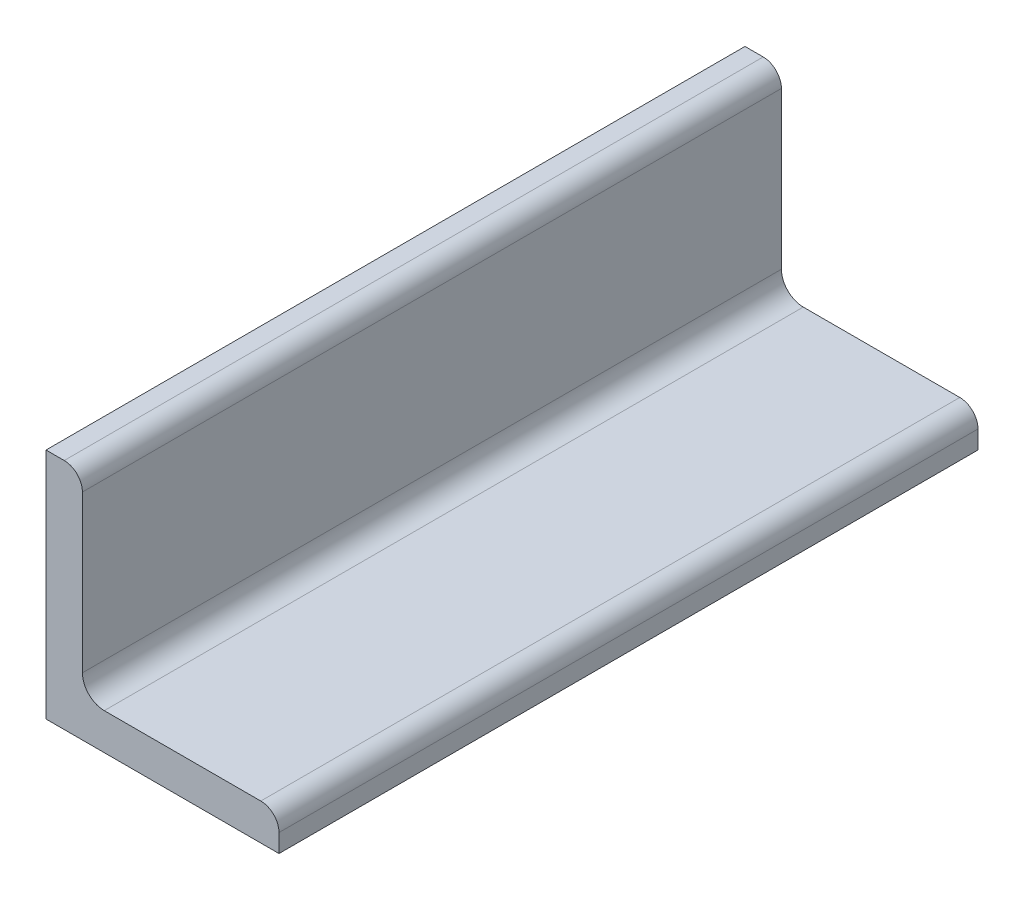
ISO-10303-21;
HEADER;
FILE_DESCRIPTION(('STEP AP214'),'2;1');
FILE_NAME('part.step','',(''),(''),'','','');
FILE_SCHEMA(('AUTOMOTIVE_DESIGN { 1 0 10303 214 1 1 1 1 }'));
ENDSEC;
DATA;
#1=APPLICATION_CONTEXT('core data for automotive mechanical design processes');
#2=APPLICATION_PROTOCOL_DEFINITION('international standard','automotive_design',2000,#1);
#3=PRODUCT_CONTEXT('',#1,'mechanical');
#4=PRODUCT('Part','Part','',(#3));
#5=PRODUCT_RELATED_PRODUCT_CATEGORY('part','',(#4));
#6=PRODUCT_DEFINITION_FORMATION('','',#4);
#7=PRODUCT_DEFINITION_CONTEXT('part definition',#1,'design');
#8=PRODUCT_DEFINITION('design','',#6,#7);
#9=PRODUCT_DEFINITION_SHAPE('','',#8);
#10=(LENGTH_UNIT() NAMED_UNIT(*) SI_UNIT(.MILLI.,.METRE.));
#11=(NAMED_UNIT(*) PLANE_ANGLE_UNIT() SI_UNIT($,.RADIAN.));
#12=(NAMED_UNIT(*) SI_UNIT($,.STERADIAN.) SOLID_ANGLE_UNIT());
#13=UNCERTAINTY_MEASURE_WITH_UNIT(LENGTH_MEASURE(1.E-05),#10,'distance_accuracy_value','');
#14=(GEOMETRIC_REPRESENTATION_CONTEXT(3) GLOBAL_UNCERTAINTY_ASSIGNED_CONTEXT((#13)) GLOBAL_UNIT_ASSIGNED_CONTEXT((#10,
#11,#12)) REPRESENTATION_CONTEXT('',''));
#15=CARTESIAN_POINT('',(0.,0.,0.));
#16=DIRECTION('',(0.,0.,1.));
#17=DIRECTION('',(1.,0.,0.));
#18=AXIS2_PLACEMENT_3D('',#15,#16,#17);
#19=CARTESIAN_POINT('',(0.865045893659089,102.172018782971,304.8));
#20=DIRECTION('',(1.,0.,0.));
#21=DIRECTION('',(0.,0.,-1.));
#22=AXIS2_PLACEMENT_3D('',#19,#20,#21);
#23=PLANE('',#22);
#24=DIRECTION('',(0.,-1.,0.));
#25=VECTOR('',#24,1.);
#26=CARTESIAN_POINT('',(0.865045893659089,102.172018782971,0.));
#27=LINE('',#26,#25);
#28=CARTESIAN_POINT('',(0.865045893659089,102.172018782971,0.));
#29=VERTEX_POINT('',#28);
#30=CARTESIAN_POINT('',(0.865045893659089,0.572018782971054,0.));
#31=VERTEX_POINT('',#30);
#32=EDGE_CURVE('E135',#29,#31,#27,.T.);
#33=ORIENTED_EDGE('',*,*,#32,.T.);
#34=DIRECTION('',(0.,0.,-1.));
#35=VECTOR('',#34,1.);
#36=CARTESIAN_POINT('',(0.865045893659089,0.572018782971054,304.8));
#37=LINE('',#36,#35);
#38=CARTESIAN_POINT('',(0.865045893659089,0.572018782971054,304.8));
#39=VERTEX_POINT('',#38);
#40=EDGE_CURVE('E11',#39,#31,#37,.T.);
#41=ORIENTED_EDGE('',*,*,#40,.F.);
#42=DIRECTION('',(0.,-1.,0.));
#43=VECTOR('',#42,1.);
#44=CARTESIAN_POINT('',(0.865045893659089,102.172018782971,304.8));
#45=LINE('',#44,#43);
#46=CARTESIAN_POINT('',(0.865045893659089,102.172018782971,304.8));
#47=VERTEX_POINT('',#46);
#48=EDGE_CURVE('E151',#47,#39,#45,.T.);
#49=ORIENTED_EDGE('',*,*,#48,.F.);
#50=DIRECTION('',(0.,0.,-1.));
#51=VECTOR('',#50,1.);
#52=CARTESIAN_POINT('',(0.865045893659089,102.172018782971,304.8));
#53=LINE('',#52,#51);
#54=EDGE_CURVE('E131',#47,#29,#53,.T.);
#55=ORIENTED_EDGE('',*,*,#54,.T.);
#56=EDGE_LOOP('',(#33,#41,#49,#55));
#57=FACE_BOUND('',#56,.T.);
#58=ADVANCED_FACE('F33',(#57),#23,.F.);
#59=CARTESIAN_POINT('',(0.865045893659089,0.572018782971054,304.8));
#60=DIRECTION('',(0.,1.,0.));
#61=DIRECTION('',(0.,0.,1.));
#62=AXIS2_PLACEMENT_3D('',#59,#60,#61);
#63=PLANE('',#62);
#64=DIRECTION('',(1.,0.,0.));
#65=VECTOR('',#64,1.);
#66=CARTESIAN_POINT('',(0.865045893659089,0.572018782971054,0.));
#67=LINE('',#66,#65);
#68=CARTESIAN_POINT('',(102.465045893659,0.572018782971054,0.));
#69=VERTEX_POINT('',#68);
#70=EDGE_CURVE('E138',#31,#69,#67,.T.);
#71=ORIENTED_EDGE('',*,*,#70,.T.);
#72=DIRECTION('',(0.,0.,-1.));
#73=VECTOR('',#72,1.);
#74=CARTESIAN_POINT('',(102.465045893659,0.572018782971054,304.8));
#75=LINE('',#74,#73);
#76=CARTESIAN_POINT('',(102.465045893659,0.572018782971054,304.8));
#77=VERTEX_POINT('',#76);
#78=EDGE_CURVE('E41',#77,#69,#75,.T.);
#79=ORIENTED_EDGE('',*,*,#78,.F.);
#80=DIRECTION('',(1.,0.,0.));
#81=VECTOR('',#80,1.);
#82=CARTESIAN_POINT('',(0.865045893659089,0.572018782971054,304.8));
#83=LINE('',#82,#81);
#84=EDGE_CURVE('E95',#39,#77,#83,.T.);
#85=ORIENTED_EDGE('',*,*,#84,.F.);
#86=ORIENTED_EDGE('',*,*,#40,.T.);
#87=EDGE_LOOP('',(#71,#79,#85,#86));
#88=FACE_BOUND('',#87,.T.);
#89=ADVANCED_FACE('F194',(#88),#63,.F.);
#90=CARTESIAN_POINT('',(102.465045893659,0.572018782971054,304.8));
#91=DIRECTION('',(-1.,0.,0.));
#92=DIRECTION('',(0.,0.,1.));
#93=AXIS2_PLACEMENT_3D('',#90,#91,#92);
#94=PLANE('',#93);
#95=DIRECTION('',(0.,1.,0.));
#96=VECTOR('',#95,1.);
#97=CARTESIAN_POINT('',(102.465045893659,0.572018782971054,0.));
#98=LINE('',#97,#96);
#99=CARTESIAN_POINT('',(102.465045893659,8.50951878297105,0.));
#100=VERTEX_POINT('',#99);
#101=EDGE_CURVE('E140',#69,#100,#98,.T.);
#102=ORIENTED_EDGE('',*,*,#101,.T.);
#103=DIRECTION('',(0.,0.,-1.));
#104=VECTOR('',#103,1.);
#105=CARTESIAN_POINT('',(102.465045893659,8.50951878297105,304.8));
#106=LINE('',#105,#104);
#107=CARTESIAN_POINT('',(102.465045893659,8.50951878297105,304.8));
#108=VERTEX_POINT('',#107);
#109=EDGE_CURVE('E161',#108,#100,#106,.T.);
#110=ORIENTED_EDGE('',*,*,#109,.F.);
#111=DIRECTION('',(0.,1.,0.));
#112=VECTOR('',#111,1.);
#113=CARTESIAN_POINT('',(102.465045893659,0.572018782971054,304.8));
#114=LINE('',#113,#112);
#115=EDGE_CURVE('E169',#77,#108,#114,.T.);
#116=ORIENTED_EDGE('',*,*,#115,.F.);
#117=ORIENTED_EDGE('',*,*,#78,.T.);
#118=EDGE_LOOP('',(#102,#110,#116,#117));
#119=FACE_BOUND('',#118,.T.);
#120=ADVANCED_FACE('F167',(#119),#94,.F.);
#121=CARTESIAN_POINT('',(94.5275458936591,8.50951878297105,304.8));
#122=DIRECTION('',(0.,0.,-1.));
#123=DIRECTION('',(-1.,0.,0.));
#124=AXIS2_PLACEMENT_3D('',#121,#122,#123);
#125=CYLINDRICAL_SURFACE('',#124,7.93750000000001);
#126=CARTESIAN_POINT('',(94.5275458936591,8.50951878297105,0.));
#127=DIRECTION('',(0.,0.,1.));
#128=DIRECTION('',(1.,0.,0.));
#129=AXIS2_PLACEMENT_3D('',#126,#127,#128);
#130=CIRCLE('',#129,7.93750000000001);
#131=CARTESIAN_POINT('',(94.5275458936591,16.4470187829711,0.));
#132=VERTEX_POINT('',#131);
#133=EDGE_CURVE('E142',#100,#132,#130,.T.);
#134=ORIENTED_EDGE('',*,*,#133,.T.);
#135=DIRECTION('',(0.,0.,-1.));
#136=VECTOR('',#135,1.);
#137=CARTESIAN_POINT('',(94.5275458936591,16.4470187829711,304.8));
#138=LINE('',#137,#136);
#139=CARTESIAN_POINT('',(94.5275458936591,16.4470187829711,304.8));
#140=VERTEX_POINT('',#139);
#141=EDGE_CURVE('E158',#140,#132,#138,.T.);
#142=ORIENTED_EDGE('',*,*,#141,.F.);
#143=CARTESIAN_POINT('',(94.5275458936591,8.50951878297105,304.8));
#144=DIRECTION('',(0.,0.,1.));
#145=DIRECTION('',(1.,0.,0.));
#146=AXIS2_PLACEMENT_3D('',#143,#144,#145);
#147=CIRCLE('',#146,7.93750000000001);
#148=EDGE_CURVE('E185',#108,#140,#147,.T.);
#149=ORIENTED_EDGE('',*,*,#148,.F.);
#150=ORIENTED_EDGE('',*,*,#109,.T.);
#151=EDGE_LOOP('',(#134,#142,#149,#150));
#152=FACE_BOUND('',#151,.T.);
#153=ADVANCED_FACE('F178',(#152),#125,.T.);
#154=CARTESIAN_POINT('',(94.5275458936591,16.4470187829711,304.8));
#155=DIRECTION('',(0.,-1.,0.));
#156=DIRECTION('',(0.,0.,-1.));
#157=AXIS2_PLACEMENT_3D('',#154,#155,#156);
#158=PLANE('',#157);
#159=DIRECTION('',(-1.,0.,0.));
#160=VECTOR('',#159,1.);
#161=CARTESIAN_POINT('',(94.5275458936591,16.4470187829711,0.));
#162=LINE('',#161,#160);
#163=CARTESIAN_POINT('',(26.2650458936591,16.4470187829711,0.));
#164=VERTEX_POINT('',#163);
#165=EDGE_CURVE('E144',#132,#164,#162,.T.);
#166=ORIENTED_EDGE('',*,*,#165,.T.);
#167=DIRECTION('',(0.,0.,-1.));
#168=VECTOR('',#167,1.);
#169=CARTESIAN_POINT('',(26.2650458936591,16.4470187829711,304.8));
#170=LINE('',#169,#168);
#171=CARTESIAN_POINT('',(26.2650458936591,16.4470187829711,304.8));
#172=VERTEX_POINT('',#171);
#173=EDGE_CURVE('E155',#172,#164,#170,.T.);
#174=ORIENTED_EDGE('',*,*,#173,.F.);
#175=DIRECTION('',(-1.,0.,0.));
#176=VECTOR('',#175,1.);
#177=CARTESIAN_POINT('',(94.5275458936591,16.4470187829711,304.8));
#178=LINE('',#177,#176);
#179=EDGE_CURVE('E184',#140,#172,#178,.T.);
#180=ORIENTED_EDGE('',*,*,#179,.F.);
#181=ORIENTED_EDGE('',*,*,#141,.T.);
#182=EDGE_LOOP('',(#166,#174,#180,#181));
#183=FACE_BOUND('',#182,.T.);
#184=ADVANCED_FACE('F182',(#183),#158,.F.);
#185=CARTESIAN_POINT('',(26.2650458936591,25.972018782971,304.8));
#186=DIRECTION('',(0.,0.,-1.));
#187=DIRECTION('',(-1.,0.,0.));
#188=AXIS2_PLACEMENT_3D('',#185,#186,#187);
#189=CYLINDRICAL_SURFACE('',#188,9.52499999999999);
#190=CARTESIAN_POINT('',(26.2650458936591,25.972018782971,0.));
#191=DIRECTION('',(0.,0.,-1.));
#192=DIRECTION('',(1.,0.,0.));
#193=AXIS2_PLACEMENT_3D('',#190,#191,#192);
#194=CIRCLE('',#193,9.52499999999999);
#195=CARTESIAN_POINT('',(16.7400458936591,25.9720187829711,0.));
#196=VERTEX_POINT('',#195);
#197=EDGE_CURVE('E146',#164,#196,#194,.T.);
#198=ORIENTED_EDGE('',*,*,#197,.T.);
#199=DIRECTION('',(0.,0.,-1.));
#200=VECTOR('',#199,1.);
#201=CARTESIAN_POINT('',(16.7400458936591,25.9720187829711,304.8));
#202=LINE('',#201,#200);
#203=CARTESIAN_POINT('',(16.7400458936591,25.9720187829711,304.8));
#204=VERTEX_POINT('',#203);
#205=EDGE_CURVE('E126',#204,#196,#202,.T.);
#206=ORIENTED_EDGE('',*,*,#205,.F.);
#207=CARTESIAN_POINT('',(26.2650458936591,25.972018782971,304.8));
#208=DIRECTION('',(0.,0.,-1.));
#209=DIRECTION('',(1.,0.,0.));
#210=AXIS2_PLACEMENT_3D('',#207,#208,#209);
#211=CIRCLE('',#210,9.52499999999999);
#212=EDGE_CURVE('E117',#172,#204,#211,.T.);
#213=ORIENTED_EDGE('',*,*,#212,.F.);
#214=ORIENTED_EDGE('',*,*,#173,.T.);
#215=EDGE_LOOP('',(#198,#206,#213,#214));
#216=FACE_BOUND('',#215,.T.);
#217=ADVANCED_FACE('F206',(#216),#189,.F.);
#218=CARTESIAN_POINT('',(16.7400458936591,25.9720187829711,304.8));
#219=DIRECTION('',(-1.,0.,0.));
#220=DIRECTION('',(0.,0.,1.));
#221=AXIS2_PLACEMENT_3D('',#218,#219,#220);
#222=PLANE('',#221);
#223=DIRECTION('',(0.,1.,0.));
#224=VECTOR('',#223,1.);
#225=CARTESIAN_POINT('',(16.7400458936591,25.9720187829711,0.));
#226=LINE('',#225,#224);
#227=CARTESIAN_POINT('',(16.7400458936591,94.2345187829711,0.));
#228=VERTEX_POINT('',#227);
#229=EDGE_CURVE('E125',#196,#228,#226,.T.);
#230=ORIENTED_EDGE('',*,*,#229,.T.);
#231=DIRECTION('',(0.,0.,-1.));
#232=VECTOR('',#231,1.);
#233=CARTESIAN_POINT('',(16.7400458936591,94.2345187829711,304.8));
#234=LINE('',#233,#232);
#235=CARTESIAN_POINT('',(16.7400458936591,94.2345187829711,304.8));
#236=VERTEX_POINT('',#235);
#237=EDGE_CURVE('E122',#236,#228,#234,.T.);
#238=ORIENTED_EDGE('',*,*,#237,.F.);
#239=DIRECTION('',(0.,1.,0.));
#240=VECTOR('',#239,1.);
#241=CARTESIAN_POINT('',(16.7400458936591,25.9720187829711,304.8));
#242=LINE('',#241,#240);
#243=EDGE_CURVE('E111',#204,#236,#242,.T.);
#244=ORIENTED_EDGE('',*,*,#243,.F.);
#245=ORIENTED_EDGE('',*,*,#205,.T.);
#246=EDGE_LOOP('',(#230,#238,#244,#245));
#247=FACE_BOUND('',#246,.T.);
#248=ADVANCED_FACE('F123',(#247),#222,.F.);
#249=CARTESIAN_POINT('',(8.8025458936591,94.234518782971,304.8));
#250=DIRECTION('',(0.,0.,-1.));
#251=DIRECTION('',(-1.,0.,0.));
#252=AXIS2_PLACEMENT_3D('',#249,#250,#251);
#253=CYLINDRICAL_SURFACE('',#252,7.9375);
#254=CARTESIAN_POINT('',(8.8025458936591,94.234518782971,0.));
#255=DIRECTION('',(0.,0.,1.));
#256=DIRECTION('',(1.,0.,0.));
#257=AXIS2_PLACEMENT_3D('',#254,#255,#256);
#258=CIRCLE('',#257,7.9375);
#259=CARTESIAN_POINT('',(8.80254589365909,102.172018782971,0.));
#260=VERTEX_POINT('',#259);
#261=EDGE_CURVE('E81',#228,#260,#258,.T.);
#262=ORIENTED_EDGE('',*,*,#261,.T.);
#263=DIRECTION('',(0.,0.,-1.));
#264=VECTOR('',#263,1.);
#265=CARTESIAN_POINT('',(8.80254589365909,102.172018782971,304.8));
#266=LINE('',#265,#264);
#267=CARTESIAN_POINT('',(8.80254589365909,102.172018782971,304.8));
#268=VERTEX_POINT('',#267);
#269=EDGE_CURVE('E127',#268,#260,#266,.T.);
#270=ORIENTED_EDGE('',*,*,#269,.F.);
#271=CARTESIAN_POINT('',(8.8025458936591,94.234518782971,304.8));
#272=DIRECTION('',(0.,0.,1.));
#273=DIRECTION('',(1.,0.,0.));
#274=AXIS2_PLACEMENT_3D('',#271,#272,#273);
#275=CIRCLE('',#274,7.9375);
#276=EDGE_CURVE('E115',#236,#268,#275,.T.);
#277=ORIENTED_EDGE('',*,*,#276,.F.);
#278=ORIENTED_EDGE('',*,*,#237,.T.);
#279=EDGE_LOOP('',(#262,#270,#277,#278));
#280=FACE_BOUND('',#279,.T.);
#281=ADVANCED_FACE('F129',(#280),#253,.T.);
#282=CARTESIAN_POINT('',(8.80254589365909,102.172018782971,304.8));
#283=DIRECTION('',(0.,-1.,0.));
#284=DIRECTION('',(0.,0.,-1.));
#285=AXIS2_PLACEMENT_3D('',#282,#283,#284);
#286=PLANE('',#285);
#287=DIRECTION('',(-1.,0.,0.));
#288=VECTOR('',#287,1.);
#289=CARTESIAN_POINT('',(8.80254589365909,102.172018782971,0.));
#290=LINE('',#289,#288);
#291=EDGE_CURVE('E87',#260,#29,#290,.T.);
#292=ORIENTED_EDGE('',*,*,#291,.T.);
#293=ORIENTED_EDGE('',*,*,#54,.F.);
#294=DIRECTION('',(-1.,0.,0.));
#295=VECTOR('',#294,1.);
#296=CARTESIAN_POINT('',(8.80254589365909,102.172018782971,304.8));
#297=LINE('',#296,#295);
#298=EDGE_CURVE('E49',#268,#47,#297,.T.);
#299=ORIENTED_EDGE('',*,*,#298,.F.);
#300=ORIENTED_EDGE('',*,*,#269,.T.);
#301=EDGE_LOOP('',(#292,#293,#299,#300));
#302=FACE_BOUND('',#301,.T.);
#303=ADVANCED_FACE('F214',(#302),#286,.F.);
#304=CARTESIAN_POINT('',(94.5275458936591,8.50951878297105,304.8));
#305=DIRECTION('',(0.,0.,1.));
#306=DIRECTION('',(1.,0.,0.));
#307=AXIS2_PLACEMENT_3D('',#304,#305,#306);
#308=PLANE('',#307);
#309=ORIENTED_EDGE('',*,*,#48,.T.);
#310=ORIENTED_EDGE('',*,*,#84,.T.);
#311=ORIENTED_EDGE('',*,*,#115,.T.);
#312=ORIENTED_EDGE('',*,*,#148,.T.);
#313=ORIENTED_EDGE('',*,*,#179,.T.);
#314=ORIENTED_EDGE('',*,*,#212,.T.);
#315=ORIENTED_EDGE('',*,*,#243,.T.);
#316=ORIENTED_EDGE('',*,*,#276,.T.);
#317=ORIENTED_EDGE('',*,*,#298,.T.);
#318=EDGE_LOOP('',(#309,#310,#311,#312,#313,#314,#315,#316,#317));
#319=FACE_BOUND('',#318,.T.);
#320=ADVANCED_FACE('F113',(#319),#308,.T.);
#321=CARTESIAN_POINT('',(94.5275458936591,8.50951878297105,0.));
#322=DIRECTION('',(0.,0.,1.));
#323=DIRECTION('',(1.,0.,0.));
#324=AXIS2_PLACEMENT_3D('',#321,#322,#323);
#325=PLANE('',#324);
#326=ORIENTED_EDGE('',*,*,#32,.F.);
#327=ORIENTED_EDGE('',*,*,#291,.F.);
#328=ORIENTED_EDGE('',*,*,#261,.F.);
#329=ORIENTED_EDGE('',*,*,#229,.F.);
#330=ORIENTED_EDGE('',*,*,#197,.F.);
#331=ORIENTED_EDGE('',*,*,#165,.F.);
#332=ORIENTED_EDGE('',*,*,#133,.F.);
#333=ORIENTED_EDGE('',*,*,#101,.F.);
#334=ORIENTED_EDGE('',*,*,#70,.F.);
#335=EDGE_LOOP('',(#326,#327,#328,#329,#330,#331,#332,#333,#334));
#336=FACE_BOUND('',#335,.T.);
#337=ADVANCED_FACE('F173',(#336),#325,.F.);
#338=CLOSED_SHELL('',(#58,#89,#120,#153,#184,#217,#248,#281,#303,#320,#337));
#339=MANIFOLD_SOLID_BREP('B2',#338);
#340=ADVANCED_BREP_SHAPE_REPRESENTATION('',(#18,#339),#14);
#341=SHAPE_DEFINITION_REPRESENTATION(#9,#340);
ENDSEC;
END-ISO-10303-21;
